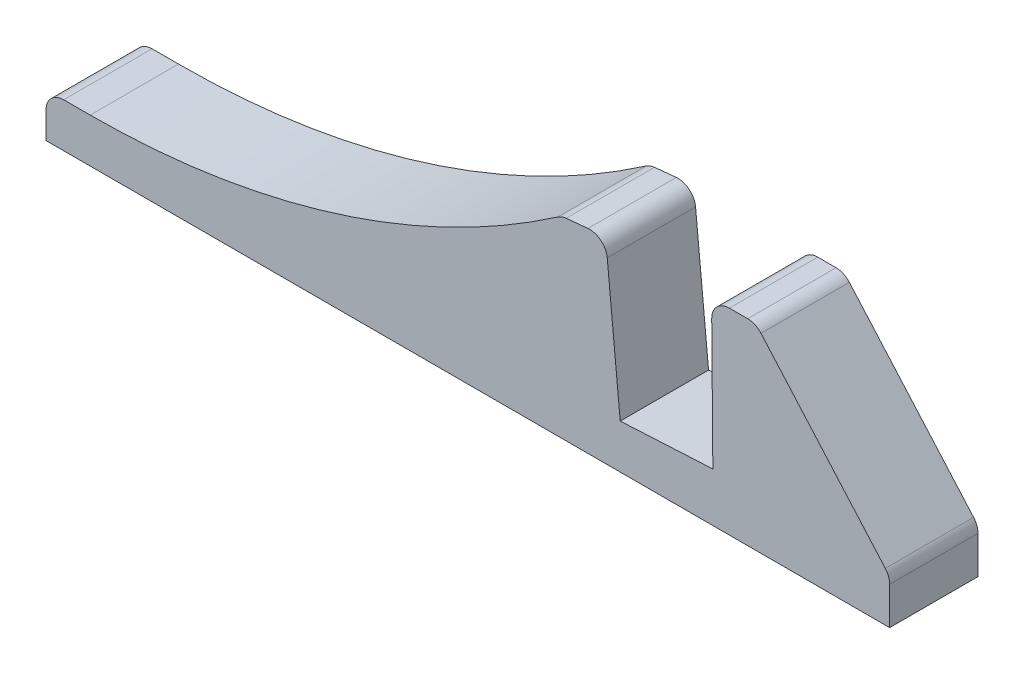
ISO-10303-21;
HEADER;
FILE_DESCRIPTION(('STEP AP214'),'2;1');
FILE_NAME('part.step','',(''),(''),'','','');
FILE_SCHEMA(('AUTOMOTIVE_DESIGN { 1 0 10303 214 1 1 1 1 }'));
ENDSEC;
DATA;
#1=APPLICATION_CONTEXT('core data for automotive mechanical design processes');
#2=APPLICATION_PROTOCOL_DEFINITION('international standard','automotive_design',2000,#1);
#3=PRODUCT_CONTEXT('',#1,'mechanical');
#4=PRODUCT('Part','Part','',(#3));
#5=PRODUCT_RELATED_PRODUCT_CATEGORY('part','',(#4));
#6=PRODUCT_DEFINITION_FORMATION('','',#4);
#7=PRODUCT_DEFINITION_CONTEXT('part definition',#1,'design');
#8=PRODUCT_DEFINITION('design','',#6,#7);
#9=PRODUCT_DEFINITION_SHAPE('','',#8);
#10=(LENGTH_UNIT() NAMED_UNIT(*) SI_UNIT(.MILLI.,.METRE.));
#11=(NAMED_UNIT(*) PLANE_ANGLE_UNIT() SI_UNIT($,.RADIAN.));
#12=(NAMED_UNIT(*) SI_UNIT($,.STERADIAN.) SOLID_ANGLE_UNIT());
#13=UNCERTAINTY_MEASURE_WITH_UNIT(LENGTH_MEASURE(1.E-05),#10,'distance_accuracy_value','');
#14=(GEOMETRIC_REPRESENTATION_CONTEXT(3) GLOBAL_UNCERTAINTY_ASSIGNED_CONTEXT((#13)) GLOBAL_UNIT_ASSIGNED_CONTEXT((#10,
#11,#12)) REPRESENTATION_CONTEXT('',''));
#15=CARTESIAN_POINT('',(0.,0.,0.));
#16=DIRECTION('',(0.,0.,1.));
#17=DIRECTION('',(1.,0.,0.));
#18=AXIS2_PLACEMENT_3D('',#15,#16,#17);
#19=CARTESIAN_POINT('',(0.,0.,10.));
#20=DIRECTION('',(1.,0.,0.));
#21=DIRECTION('',(0.,0.,-1.));
#22=AXIS2_PLACEMENT_3D('',#19,#20,#21);
#23=PLANE('',#22);
#24=DIRECTION('',(0.,-1.,0.));
#25=VECTOR('',#24,1.);
#26=CARTESIAN_POINT('',(0.,0.,10.));
#27=LINE('',#26,#25);
#28=CARTESIAN_POINT('',(0.,3.,10.));
#29=VERTEX_POINT('',#28);
#30=CARTESIAN_POINT('',(0.,0.,10.));
#31=VERTEX_POINT('',#30);
#32=EDGE_CURVE('E151',#29,#31,#27,.T.);
#33=ORIENTED_EDGE('',*,*,#32,.F.);
#34=DIRECTION('',(0.,0.,-1.));
#35=VECTOR('',#34,1.);
#36=CARTESIAN_POINT('',(0.,3.,10.));
#37=LINE('',#36,#35);
#38=CARTESIAN_POINT('',(0.,3.,0.));
#39=VERTEX_POINT('',#38);
#40=EDGE_CURVE('E178',#29,#39,#37,.T.);
#41=ORIENTED_EDGE('',*,*,#40,.T.);
#42=DIRECTION('',(0.,-1.,0.));
#43=VECTOR('',#42,1.);
#44=CARTESIAN_POINT('',(0.,0.,0.));
#45=LINE('',#44,#43);
#46=CARTESIAN_POINT('',(0.,0.,0.));
#47=VERTEX_POINT('',#46);
#48=EDGE_CURVE('E176',#39,#47,#45,.T.);
#49=ORIENTED_EDGE('',*,*,#48,.T.);
#50=DIRECTION('',(0.,0.,-1.));
#51=VECTOR('',#50,1.);
#52=CARTESIAN_POINT('',(0.,0.,10.));
#53=LINE('',#52,#51);
#54=EDGE_CURVE('E169',#31,#47,#53,.T.);
#55=ORIENTED_EDGE('',*,*,#54,.F.);
#56=EDGE_LOOP('',(#33,#41,#49,#55));
#57=FACE_BOUND('',#56,.T.);
#58=ADVANCED_FACE('F33',(#57),#23,.F.);
#59=CARTESIAN_POINT('',(0.,0.,10.));
#60=DIRECTION('',(0.,1.,0.));
#61=DIRECTION('',(0.,0.,1.));
#62=AXIS2_PLACEMENT_3D('',#59,#60,#61);
#63=PLANE('',#62);
#64=DIRECTION('',(1.,0.,0.));
#65=VECTOR('',#64,1.);
#66=CARTESIAN_POINT('',(0.,0.,0.));
#67=LINE('',#66,#65);
#68=CARTESIAN_POINT('',(95.5,0.,0.));
#69=VERTEX_POINT('',#68);
#70=EDGE_CURVE('E312',#47,#69,#67,.T.);
#71=ORIENTED_EDGE('',*,*,#70,.T.);
#72=DIRECTION('',(0.,0.,-1.));
#73=VECTOR('',#72,1.);
#74=CARTESIAN_POINT('',(95.5,0.,10.));
#75=LINE('',#74,#73);
#76=CARTESIAN_POINT('',(95.5,0.,10.));
#77=VERTEX_POINT('',#76);
#78=EDGE_CURVE('E171',#77,#69,#75,.T.);
#79=ORIENTED_EDGE('',*,*,#78,.F.);
#80=DIRECTION('',(1.,0.,0.));
#81=VECTOR('',#80,1.);
#82=CARTESIAN_POINT('',(0.,0.,10.));
#83=LINE('',#82,#81);
#84=EDGE_CURVE('E156',#31,#77,#83,.T.);
#85=ORIENTED_EDGE('',*,*,#84,.F.);
#86=ORIENTED_EDGE('',*,*,#54,.T.);
#87=EDGE_LOOP('',(#71,#79,#85,#86));
#88=FACE_BOUND('',#87,.T.);
#89=ADVANCED_FACE('F168',(#88),#63,.F.);
#90=CARTESIAN_POINT('',(95.5,0.,10.));
#91=DIRECTION('',(-1.,0.,0.));
#92=DIRECTION('',(0.,0.,1.));
#93=AXIS2_PLACEMENT_3D('',#90,#91,#92);
#94=PLANE('',#93);
#95=DIRECTION('',(0.,1.,0.));
#96=VECTOR('',#95,1.);
#97=CARTESIAN_POINT('',(95.5,0.,0.));
#98=LINE('',#97,#96);
#99=CARTESIAN_POINT('',(95.5,4.24609387964052,0.));
#100=VERTEX_POINT('',#99);
#101=EDGE_CURVE('E260',#69,#100,#98,.T.);
#102=ORIENTED_EDGE('',*,*,#101,.T.);
#103=DIRECTION('',(0.,0.,-1.));
#104=VECTOR('',#103,1.);
#105=CARTESIAN_POINT('',(95.5,4.24609387964052,10.));
#106=LINE('',#105,#104);
#107=CARTESIAN_POINT('',(95.5,4.24609387964052,10.));
#108=VERTEX_POINT('',#107);
#109=EDGE_CURVE('E11',#100,#108,#106,.F.);
#110=ORIENTED_EDGE('',*,*,#109,.T.);
#111=DIRECTION('',(0.,1.,0.));
#112=VECTOR('',#111,1.);
#113=CARTESIAN_POINT('',(95.5,0.,10.));
#114=LINE('',#113,#112);
#115=EDGE_CURVE('E173',#77,#108,#114,.T.);
#116=ORIENTED_EDGE('',*,*,#115,.F.);
#117=ORIENTED_EDGE('',*,*,#78,.T.);
#118=EDGE_LOOP('',(#102,#110,#116,#117));
#119=FACE_BOUND('',#118,.T.);
#120=ADVANCED_FACE('F317',(#119),#94,.F.);
#121=CARTESIAN_POINT('',(80.33985450735,22.2514658611032,10.));
#122=DIRECTION('',(-0.751169941960769,-0.660108868516895,0.));
#123=DIRECTION('',(0.660108868516895,-0.751169941960769,0.));
#124=AXIS2_PLACEMENT_3D('',#121,#122,#123);
#125=PLANE('',#124);
#126=DIRECTION('',(-0.660108868516895,0.751169941960769,0.));
#127=VECTOR('',#126,1.);
#128=CARTESIAN_POINT('',(80.33985450735,22.2514658611032,0.));
#129=LINE('',#128,#127);
#130=CARTESIAN_POINT('',(95.0023398839215,5.56631161667431,0.));
#131=VERTEX_POINT('',#130);
#132=CARTESIAN_POINT('',(80.9372297155129,21.571683598137,0.));
#133=VERTEX_POINT('',#132);
#134=EDGE_CURVE('E237',#131,#133,#129,.T.);
#135=ORIENTED_EDGE('',*,*,#134,.T.);
#136=DIRECTION('',(0.,0.,-1.));
#137=VECTOR('',#136,1.);
#138=CARTESIAN_POINT('',(80.9372297155129,21.571683598137,10.));
#139=LINE('',#138,#137);
#140=CARTESIAN_POINT('',(80.9372297155129,21.571683598137,10.));
#141=VERTEX_POINT('',#140);
#142=EDGE_CURVE('E41',#133,#141,#139,.F.);
#143=ORIENTED_EDGE('',*,*,#142,.T.);
#144=DIRECTION('',(-0.660108868516895,0.751169941960769,0.));
#145=VECTOR('',#144,1.);
#146=CARTESIAN_POINT('',(80.33985450735,22.2514658611032,10.));
#147=LINE('',#146,#145);
#148=CARTESIAN_POINT('',(95.0023398839215,5.56631161667431,10.));
#149=VERTEX_POINT('',#148);
#150=EDGE_CURVE('E234',#149,#141,#147,.T.);
#151=ORIENTED_EDGE('',*,*,#150,.F.);
#152=DIRECTION('',(0.,0.,-1.));
#153=VECTOR('',#152,1.);
#154=CARTESIAN_POINT('',(95.0023398839215,5.56631161667431,10.));
#155=LINE('',#154,#153);
#156=EDGE_CURVE('E226',#149,#131,#155,.T.);
#157=ORIENTED_EDGE('',*,*,#156,.T.);
#158=EDGE_LOOP('',(#135,#143,#151,#157));
#159=FACE_BOUND('',#158,.T.);
#160=ADVANCED_FACE('F233',(#159),#125,.F.);
#161=CARTESIAN_POINT('',(75.3398545073501,22.2514658611032,10.));
#162=DIRECTION('',(0.,-1.,0.));
#163=DIRECTION('',(0.,0.,-1.));
#164=AXIS2_PLACEMENT_3D('',#161,#162,#163);
#165=PLANE('',#164);
#166=DIRECTION('',(-1.,0.,0.));
#167=VECTOR('',#166,1.);
#168=CARTESIAN_POINT('',(75.3398545073501,22.2514658611032,0.));
#169=LINE('',#168,#167);
#170=CARTESIAN_POINT('',(79.4348898315913,22.2514658611032,0.));
#171=VERTEX_POINT('',#170);
#172=CARTESIAN_POINT('',(77.3573843997031,22.2514658611032,0.));
#173=VERTEX_POINT('',#172);
#174=EDGE_CURVE('E251',#171,#173,#169,.T.);
#175=ORIENTED_EDGE('',*,*,#174,.T.);
#176=DIRECTION('',(0.,0.,-1.));
#177=VECTOR('',#176,1.);
#178=CARTESIAN_POINT('',(77.3573843997031,22.2514658611032,10.));
#179=LINE('',#178,#177);
#180=CARTESIAN_POINT('',(77.3573843997031,22.2514658611032,10.));
#181=VERTEX_POINT('',#180);
#182=EDGE_CURVE('E224',#173,#181,#179,.F.);
#183=ORIENTED_EDGE('',*,*,#182,.T.);
#184=DIRECTION('',(-1.,0.,0.));
#185=VECTOR('',#184,1.);
#186=CARTESIAN_POINT('',(75.3398545073501,22.2514658611032,10.));
#187=LINE('',#186,#185);
#188=CARTESIAN_POINT('',(79.4348898315913,22.2514658611032,10.));
#189=VERTEX_POINT('',#188);
#190=EDGE_CURVE('E243',#189,#181,#187,.T.);
#191=ORIENTED_EDGE('',*,*,#190,.F.);
#192=DIRECTION('',(0.,0.,-1.));
#193=VECTOR('',#192,1.);
#194=CARTESIAN_POINT('',(79.4348898315913,22.2514658611032,10.));
#195=LINE('',#194,#193);
#196=EDGE_CURVE('E221',#189,#171,#195,.T.);
#197=ORIENTED_EDGE('',*,*,#196,.T.);
#198=EDGE_LOOP('',(#175,#183,#191,#197));
#199=FACE_BOUND('',#198,.T.);
#200=ADVANCED_FACE('F250',(#199),#165,.F.);
#201=CARTESIAN_POINT('',(75.485610114923,5.54952754055095,10.));
#202=DIRECTION('',(0.999961923064171,0.00872653549838039,0.));
#203=DIRECTION('',(-0.00872653549838039,0.999961923064171,0.));
#204=AXIS2_PLACEMENT_3D('',#201,#202,#203);
#205=PLANE('',#204);
#206=DIRECTION('',(0.00872653549838039,-0.999961923064171,0.));
#207=VECTOR('',#206,1.);
#208=CARTESIAN_POINT('',(75.485610114923,5.54952754055095,10.));
#209=LINE('',#208,#207);
#210=CARTESIAN_POINT('',(75.3574605535747,20.2340127901065,10.));
#211=VERTEX_POINT('',#210);
#212=CARTESIAN_POINT('',(75.485610114923,5.54952754055095,10.));
#213=VERTEX_POINT('',#212);
#214=EDGE_CURVE('E348',#211,#213,#209,.T.);
#215=ORIENTED_EDGE('',*,*,#214,.F.);
#216=DIRECTION('',(0.,0.,-1.));
#217=VECTOR('',#216,1.);
#218=CARTESIAN_POINT('',(75.3574605535747,20.2340127901065,10.));
#219=LINE('',#218,#217);
#220=CARTESIAN_POINT('',(75.3574605535747,20.2340127901065,0.));
#221=VERTEX_POINT('',#220);
#222=EDGE_CURVE('E218',#211,#221,#219,.T.);
#223=ORIENTED_EDGE('',*,*,#222,.T.);
#224=DIRECTION('',(0.00872653549838039,-0.999961923064171,0.));
#225=VECTOR('',#224,1.);
#226=CARTESIAN_POINT('',(75.485610114923,5.54952754055095,0.));
#227=LINE('',#226,#225);
#228=CARTESIAN_POINT('',(75.485610114923,5.54952754055095,0.));
#229=VERTEX_POINT('',#228);
#230=EDGE_CURVE('E256',#221,#229,#227,.T.);
#231=ORIENTED_EDGE('',*,*,#230,.T.);
#232=DIRECTION('',(0.,0.,-1.));
#233=VECTOR('',#232,1.);
#234=CARTESIAN_POINT('',(75.485610114923,5.54952754055095,10.));
#235=LINE('',#234,#233);
#236=EDGE_CURVE('E182',#213,#229,#235,.T.);
#237=ORIENTED_EDGE('',*,*,#236,.F.);
#238=EDGE_LOOP('',(#215,#223,#231,#237));
#239=FACE_BOUND('',#238,.T.);
#240=ADVANCED_FACE('F349',(#239),#205,.F.);
#241=CARTESIAN_POINT('',(65.,5.,10.));
#242=DIRECTION('',(0.0523359562429482,-0.998629534754574,0.));
#243=DIRECTION('',(0.998629534754574,0.0523359562429483,0.));
#244=AXIS2_PLACEMENT_3D('',#241,#242,#243);
#245=PLANE('',#244);
#246=DIRECTION('',(-0.998629534754574,-0.0523359562429483,0.));
#247=VECTOR('',#246,1.);
#248=CARTESIAN_POINT('',(65.,5.,0.));
#249=LINE('',#248,#247);
#250=CARTESIAN_POINT('',(65.,5.,0.));
#251=VERTEX_POINT('',#250);
#252=EDGE_CURVE('E258',#229,#251,#249,.T.);
#253=ORIENTED_EDGE('',*,*,#252,.T.);
#254=DIRECTION('',(0.,0.,-1.));
#255=VECTOR('',#254,1.);
#256=CARTESIAN_POINT('',(65.,5.,10.));
#257=LINE('',#256,#255);
#258=CARTESIAN_POINT('',(65.,5.,10.));
#259=VERTEX_POINT('',#258);
#260=EDGE_CURVE('E277',#259,#251,#257,.T.);
#261=ORIENTED_EDGE('',*,*,#260,.F.);
#262=DIRECTION('',(-0.998629534754574,-0.0523359562429483,0.));
#263=VECTOR('',#262,1.);
#264=CARTESIAN_POINT('',(65.,5.,10.));
#265=LINE('',#264,#263);
#266=EDGE_CURVE('E287',#213,#259,#265,.T.);
#267=ORIENTED_EDGE('',*,*,#266,.F.);
#268=ORIENTED_EDGE('',*,*,#236,.T.);
#269=EDGE_LOOP('',(#253,#261,#267,#268));
#270=FACE_BOUND('',#269,.T.);
#271=ADVANCED_FACE('F285',(#270),#245,.F.);
#272=CARTESIAN_POINT('',(63.338872772222,22.2514658611032,10.));
#273=DIRECTION('',(-0.995396198367179,-0.0958457525202264,0.));
#274=DIRECTION('',(0.0958457525202264,-0.995396198367179,0.));
#275=AXIS2_PLACEMENT_3D('',#272,#273,#274);
#276=PLANE('',#275);
#277=DIRECTION('',(-0.0958457525202264,0.995396198367178,0.));
#278=VECTOR('',#277,1.);
#279=CARTESIAN_POINT('',(63.338872772222,22.2514658611032,0.));
#280=LINE('',#279,#278);
#281=CARTESIAN_POINT('',(63.5305642772624,20.2606734643689,0.));
#282=VERTEX_POINT('',#281);
#283=EDGE_CURVE('E265',#251,#282,#280,.T.);
#284=ORIENTED_EDGE('',*,*,#283,.T.);
#285=DIRECTION('',(0.,0.,-1.));
#286=VECTOR('',#285,1.);
#287=CARTESIAN_POINT('',(63.5305642772624,20.2606734643689,10.));
#288=LINE('',#287,#286);
#289=CARTESIAN_POINT('',(63.5305642772624,20.2606734643689,10.));
#290=VERTEX_POINT('',#289);
#291=EDGE_CURVE('E216',#282,#290,#288,.F.);
#292=ORIENTED_EDGE('',*,*,#291,.T.);
#293=DIRECTION('',(-0.0958457525202264,0.995396198367178,0.));
#294=VECTOR('',#293,1.);
#295=CARTESIAN_POINT('',(63.338872772222,22.2514658611032,10.));
#296=LINE('',#295,#294);
#297=EDGE_CURVE('E302',#259,#290,#296,.T.);
#298=ORIENTED_EDGE('',*,*,#297,.F.);
#299=ORIENTED_EDGE('',*,*,#260,.T.);
#300=EDGE_LOOP('',(#284,#292,#298,#299));
#301=FACE_BOUND('',#300,.T.);
#302=ADVANCED_FACE('F294',(#301),#276,.F.);
#303=CARTESIAN_POINT('',(63.338872772222,22.2514658611032,10.));
#304=DIRECTION('',(0.0958457525202266,-0.995396198367179,0.));
#305=DIRECTION('',(0.995396198367179,0.0958457525202266,0.));
#306=AXIS2_PLACEMENT_3D('',#303,#304,#305);
#307=PLANE('',#306);
#308=DIRECTION('',(-0.995396198367179,-0.0958457525202266,0.));
#309=VECTOR('',#308,1.);
#310=CARTESIAN_POINT('',(63.338872772222,22.2514658611032,0.));
#311=LINE('',#310,#309);
#312=CARTESIAN_POINT('',(61.3480803754876,22.0597743560628,0.));
#313=VERTEX_POINT('',#312);
#314=CARTESIAN_POINT('',(58.8811529793022,21.8222362651116,0.));
#315=VERTEX_POINT('',#314);
#316=EDGE_CURVE('E268',#313,#315,#311,.T.);
#317=ORIENTED_EDGE('',*,*,#316,.T.);
#318=DIRECTION('',(0.,0.,-1.));
#319=VECTOR('',#318,1.);
#320=CARTESIAN_POINT('',(58.8811529793022,21.8222362651116,10.));
#321=LINE('',#320,#319);
#322=CARTESIAN_POINT('',(58.8811529793022,21.8222362651116,10.));
#323=VERTEX_POINT('',#322);
#324=EDGE_CURVE('E56',#315,#323,#321,.F.);
#325=ORIENTED_EDGE('',*,*,#324,.T.);
#326=DIRECTION('',(-0.995396198367179,-0.0958457525202266,0.));
#327=VECTOR('',#326,1.);
#328=CARTESIAN_POINT('',(63.338872772222,22.2514658611032,10.));
#329=LINE('',#328,#327);
#330=CARTESIAN_POINT('',(61.3480803754876,22.0597743560628,10.));
#331=VERTEX_POINT('',#330);
#332=EDGE_CURVE('E301',#331,#323,#329,.T.);
#333=ORIENTED_EDGE('',*,*,#332,.F.);
#334=DIRECTION('',(0.,0.,-1.));
#335=VECTOR('',#334,1.);
#336=CARTESIAN_POINT('',(61.3480803754876,22.0597743560628,10.));
#337=LINE('',#336,#335);
#338=EDGE_CURVE('E212',#331,#313,#337,.T.);
#339=ORIENTED_EDGE('',*,*,#338,.T.);
#340=EDGE_LOOP('',(#317,#325,#333,#339));
#341=FACE_BOUND('',#340,.T.);
#342=ADVANCED_FACE('F303',(#341),#307,.F.);
#343=CARTESIAN_POINT('',(5.,98.2731696223588,10.));
#344=DIRECTION('',(0.,0.,-1.));
#345=DIRECTION('',(-1.,0.,0.));
#346=AXIS2_PLACEMENT_3D('',#343,#344,#345);
#347=CYLINDRICAL_SURFACE('',#346,93.2731696223588);
#348=CARTESIAN_POINT('',(5.,98.2731696223588,10.));
#349=DIRECTION('',(0.,0.,-1.));
#350=DIRECTION('',(1.,0.,0.));
#351=AXIS2_PLACEMENT_3D('',#348,#349,#350);
#352=CIRCLE('',#351,93.2731696223588);
#353=CARTESIAN_POINT('',(57.9377327902807,21.4781136719517,10.));
#354=VERTEX_POINT('',#353);
#355=CARTESIAN_POINT('',(4.99999999999998,5.00000000000002,10.));
#356=VERTEX_POINT('',#355);
#357=EDGE_CURVE('E304',#354,#356,#352,.T.);
#358=ORIENTED_EDGE('',*,*,#357,.F.);
#359=DIRECTION('',(0.,0.,-1.));
#360=VECTOR('',#359,1.);
#361=CARTESIAN_POINT('',(57.9377327902807,21.4781136719517,10.));
#362=LINE('',#361,#360);
#363=CARTESIAN_POINT('',(57.9377327902807,21.4781136719517,0.));
#364=VERTEX_POINT('',#363);
#365=EDGE_CURVE('E209',#354,#364,#362,.T.);
#366=ORIENTED_EDGE('',*,*,#365,.T.);
#367=CARTESIAN_POINT('',(5.,98.2731696223588,0.));
#368=DIRECTION('',(0.,0.,-1.));
#369=DIRECTION('',(1.,0.,0.));
#370=AXIS2_PLACEMENT_3D('',#367,#368,#369);
#371=CIRCLE('',#370,93.2731696223588);
#372=CARTESIAN_POINT('',(4.99999999999998,5.00000000000002,0.));
#373=VERTEX_POINT('',#372);
#374=EDGE_CURVE('E270',#364,#373,#371,.T.);
#375=ORIENTED_EDGE('',*,*,#374,.T.);
#376=DIRECTION('',(0.,0.,-1.));
#377=VECTOR('',#376,1.);
#378=CARTESIAN_POINT('',(4.99999999999998,5.00000000000002,10.));
#379=LINE('',#378,#377);
#380=EDGE_CURVE('E274',#356,#373,#379,.T.);
#381=ORIENTED_EDGE('',*,*,#380,.F.);
#382=EDGE_LOOP('',(#358,#366,#375,#381));
#383=FACE_BOUND('',#382,.T.);
#384=ADVANCED_FACE('F398',(#383),#347,.F.);
#385=CARTESIAN_POINT('',(0.,5.,10.));
#386=DIRECTION('',(0.,-1.,0.));
#387=DIRECTION('',(0.,0.,-1.));
#388=AXIS2_PLACEMENT_3D('',#385,#386,#387);
#389=PLANE('',#388);
#390=DIRECTION('',(-1.,0.,0.));
#391=VECTOR('',#390,1.);
#392=CARTESIAN_POINT('',(0.,5.,0.));
#393=LINE('',#392,#391);
#394=CARTESIAN_POINT('',(2.,5.,0.));
#395=VERTEX_POINT('',#394);
#396=EDGE_CURVE('E164',#373,#395,#393,.T.);
#397=ORIENTED_EDGE('',*,*,#396,.T.);
#398=DIRECTION('',(0.,0.,-1.));
#399=VECTOR('',#398,1.);
#400=CARTESIAN_POINT('',(2.,5.,10.));
#401=LINE('',#400,#399);
#402=CARTESIAN_POINT('',(2.,5.,10.));
#403=VERTEX_POINT('',#402);
#404=EDGE_CURVE('E197',#395,#403,#401,.F.);
#405=ORIENTED_EDGE('',*,*,#404,.T.);
#406=DIRECTION('',(-1.,0.,0.));
#407=VECTOR('',#406,1.);
#408=CARTESIAN_POINT('',(0.,5.,10.));
#409=LINE('',#408,#407);
#410=EDGE_CURVE('E278',#356,#403,#409,.T.);
#411=ORIENTED_EDGE('',*,*,#410,.F.);
#412=ORIENTED_EDGE('',*,*,#380,.T.);
#413=EDGE_LOOP('',(#397,#405,#411,#412));
#414=FACE_BOUND('',#413,.T.);
#415=ADVANCED_FACE('F407',(#414),#389,.F.);
#416=CARTESIAN_POINT('',(5.,98.2731696223588,10.));
#417=DIRECTION('',(0.,0.,1.));
#418=DIRECTION('',(1.,0.,0.));
#419=AXIS2_PLACEMENT_3D('',#416,#417,#418);
#420=PLANE('',#419);
#421=ORIENTED_EDGE('',*,*,#410,.T.);
#422=CARTESIAN_POINT('',(2.,3.,10.));
#423=DIRECTION('',(0.,0.,1.));
#424=DIRECTION('',(1.,0.,0.));
#425=AXIS2_PLACEMENT_3D('',#422,#423,#424);
#426=CIRCLE('',#425,2.);
#427=EDGE_CURVE('E159',#403,#29,#426,.T.);
#428=ORIENTED_EDGE('',*,*,#427,.T.);
#429=ORIENTED_EDGE('',*,*,#32,.T.);
#430=ORIENTED_EDGE('',*,*,#84,.T.);
#431=ORIENTED_EDGE('',*,*,#115,.T.);
#432=CARTESIAN_POINT('',(93.5,4.24609387964052,10.));
#433=DIRECTION('',(0.,0.,1.));
#434=DIRECTION('',(1.,0.,0.));
#435=AXIS2_PLACEMENT_3D('',#432,#433,#434);
#436=CIRCLE('',#435,2.);
#437=EDGE_CURVE('E199',#108,#149,#436,.T.);
#438=ORIENTED_EDGE('',*,*,#437,.T.);
#439=ORIENTED_EDGE('',*,*,#150,.T.);
#440=CARTESIAN_POINT('',(79.4348898315913,20.2514658611032,10.));
#441=DIRECTION('',(0.,0.,1.));
#442=DIRECTION('',(1.,0.,0.));
#443=AXIS2_PLACEMENT_3D('',#440,#441,#442);
#444=CIRCLE('',#443,2.);
#445=EDGE_CURVE('E201',#141,#189,#444,.T.);
#446=ORIENTED_EDGE('',*,*,#445,.T.);
#447=ORIENTED_EDGE('',*,*,#190,.T.);
#448=CARTESIAN_POINT('',(77.3573843997031,20.2514658611032,10.));
#449=DIRECTION('',(0.,0.,1.));
#450=DIRECTION('',(1.,0.,0.));
#451=AXIS2_PLACEMENT_3D('',#448,#449,#450);
#452=CIRCLE('',#451,2.);
#453=EDGE_CURVE('E203',#181,#211,#452,.T.);
#454=ORIENTED_EDGE('',*,*,#453,.T.);
#455=ORIENTED_EDGE('',*,*,#214,.T.);
#456=ORIENTED_EDGE('',*,*,#266,.T.);
#457=ORIENTED_EDGE('',*,*,#297,.T.);
#458=CARTESIAN_POINT('',(61.5397718805281,20.0689819593284,10.));
#459=DIRECTION('',(0.,0.,1.));
#460=DIRECTION('',(1.,0.,0.));
#461=AXIS2_PLACEMENT_3D('',#458,#459,#460);
#462=CIRCLE('',#461,2.);
#463=EDGE_CURVE('E205',#290,#331,#462,.T.);
#464=ORIENTED_EDGE('',*,*,#463,.T.);
#465=ORIENTED_EDGE('',*,*,#332,.T.);
#466=CARTESIAN_POINT('',(59.0728444843426,19.8314438683773,10.));
#467=DIRECTION('',(0.,0.,1.));
#468=DIRECTION('',(1.,0.,0.));
#469=AXIS2_PLACEMENT_3D('',#466,#467,#468);
#470=CIRCLE('',#469,2.);
#471=EDGE_CURVE('E48',#323,#354,#470,.T.);
#472=ORIENTED_EDGE('',*,*,#471,.T.);
#473=ORIENTED_EDGE('',*,*,#357,.T.);
#474=EDGE_LOOP('',(#421,#428,#429,#430,#431,#438,#439,#446,#447,#454,#455,#456,#457,#464,#465,
#472,#473));
#475=FACE_BOUND('',#474,.T.);
#476=ADVANCED_FACE('F154',(#475),#420,.T.);
#477=CARTESIAN_POINT('',(5.,98.2731696223588,0.));
#478=DIRECTION('',(0.,0.,1.));
#479=DIRECTION('',(1.,0.,0.));
#480=AXIS2_PLACEMENT_3D('',#477,#478,#479);
#481=PLANE('',#480);
#482=ORIENTED_EDGE('',*,*,#48,.F.);
#483=CARTESIAN_POINT('',(2.,3.,0.));
#484=DIRECTION('',(0.,0.,1.));
#485=DIRECTION('',(1.,0.,0.));
#486=AXIS2_PLACEMENT_3D('',#483,#484,#485);
#487=CIRCLE('',#486,2.);
#488=EDGE_CURVE('E195',#39,#395,#487,.F.);
#489=ORIENTED_EDGE('',*,*,#488,.T.);
#490=ORIENTED_EDGE('',*,*,#396,.F.);
#491=ORIENTED_EDGE('',*,*,#374,.F.);
#492=CARTESIAN_POINT('',(59.0728444843426,19.8314438683773,0.));
#493=DIRECTION('',(0.,0.,1.));
#494=DIRECTION('',(1.,0.,0.));
#495=AXIS2_PLACEMENT_3D('',#492,#493,#494);
#496=CIRCLE('',#495,2.);
#497=EDGE_CURVE('E193',#364,#315,#496,.F.);
#498=ORIENTED_EDGE('',*,*,#497,.T.);
#499=ORIENTED_EDGE('',*,*,#316,.F.);
#500=CARTESIAN_POINT('',(61.5397718805281,20.0689819593284,0.));
#501=DIRECTION('',(0.,0.,1.));
#502=DIRECTION('',(1.,0.,0.));
#503=AXIS2_PLACEMENT_3D('',#500,#501,#502);
#504=CIRCLE('',#503,2.);
#505=EDGE_CURVE('E191',#313,#282,#504,.F.);
#506=ORIENTED_EDGE('',*,*,#505,.T.);
#507=ORIENTED_EDGE('',*,*,#283,.F.);
#508=ORIENTED_EDGE('',*,*,#252,.F.);
#509=ORIENTED_EDGE('',*,*,#230,.F.);
#510=CARTESIAN_POINT('',(77.3573843997031,20.2514658611032,0.));
#511=DIRECTION('',(0.,0.,1.));
#512=DIRECTION('',(1.,0.,0.));
#513=AXIS2_PLACEMENT_3D('',#510,#511,#512);
#514=CIRCLE('',#513,2.);
#515=EDGE_CURVE('E189',#221,#173,#514,.F.);
#516=ORIENTED_EDGE('',*,*,#515,.T.);
#517=ORIENTED_EDGE('',*,*,#174,.F.);
#518=CARTESIAN_POINT('',(79.4348898315913,20.2514658611032,0.));
#519=DIRECTION('',(0.,0.,1.));
#520=DIRECTION('',(1.,0.,0.));
#521=AXIS2_PLACEMENT_3D('',#518,#519,#520);
#522=CIRCLE('',#521,2.);
#523=EDGE_CURVE('E187',#171,#133,#522,.F.);
#524=ORIENTED_EDGE('',*,*,#523,.T.);
#525=ORIENTED_EDGE('',*,*,#134,.F.);
#526=CARTESIAN_POINT('',(93.5,4.24609387964052,0.));
#527=DIRECTION('',(0.,0.,1.));
#528=DIRECTION('',(1.,0.,0.));
#529=AXIS2_PLACEMENT_3D('',#526,#527,#528);
#530=CIRCLE('',#529,2.);
#531=EDGE_CURVE('E180',#131,#100,#530,.F.);
#532=ORIENTED_EDGE('',*,*,#531,.T.);
#533=ORIENTED_EDGE('',*,*,#101,.F.);
#534=ORIENTED_EDGE('',*,*,#70,.F.);
#535=EDGE_LOOP('',(#482,#489,#490,#491,#498,#499,#506,#507,#508,#509,#516,#517,#524,#525,#532,
#533,#534));
#536=FACE_BOUND('',#535,.T.);
#537=ADVANCED_FACE('F254',(#536),#481,.F.);
#538=CARTESIAN_POINT('',(2.,3.,10.));
#539=DIRECTION('',(0.,0.,-1.));
#540=DIRECTION('',(-1.,0.,0.));
#541=AXIS2_PLACEMENT_3D('',#538,#539,#540);
#542=CYLINDRICAL_SURFACE('',#541,2.);
#543=ORIENTED_EDGE('',*,*,#427,.F.);
#544=ORIENTED_EDGE('',*,*,#404,.F.);
#545=ORIENTED_EDGE('',*,*,#488,.F.);
#546=ORIENTED_EDGE('',*,*,#40,.F.);
#547=EDGE_LOOP('',(#543,#544,#545,#546));
#548=FACE_BOUND('',#547,.T.);
#549=ADVANCED_FACE('F332',(#548),#542,.T.);
#550=CARTESIAN_POINT('',(59.0728444843426,19.8314438683773,10.));
#551=DIRECTION('',(0.,0.,-1.));
#552=DIRECTION('',(-1.,0.,0.));
#553=AXIS2_PLACEMENT_3D('',#550,#551,#552);
#554=CYLINDRICAL_SURFACE('',#553,2.);
#555=ORIENTED_EDGE('',*,*,#471,.F.);
#556=ORIENTED_EDGE('',*,*,#324,.F.);
#557=ORIENTED_EDGE('',*,*,#497,.F.);
#558=ORIENTED_EDGE('',*,*,#365,.F.);
#559=EDGE_LOOP('',(#555,#556,#557,#558));
#560=FACE_BOUND('',#559,.T.);
#561=ADVANCED_FACE('F335',(#560),#554,.T.);
#562=CARTESIAN_POINT('',(61.5397718805281,20.0689819593284,10.));
#563=DIRECTION('',(0.,0.,-1.));
#564=DIRECTION('',(-1.,0.,0.));
#565=AXIS2_PLACEMENT_3D('',#562,#563,#564);
#566=CYLINDRICAL_SURFACE('',#565,2.);
#567=ORIENTED_EDGE('',*,*,#463,.F.);
#568=ORIENTED_EDGE('',*,*,#291,.F.);
#569=ORIENTED_EDGE('',*,*,#505,.F.);
#570=ORIENTED_EDGE('',*,*,#338,.F.);
#571=EDGE_LOOP('',(#567,#568,#569,#570));
#572=FACE_BOUND('',#571,.T.);
#573=ADVANCED_FACE('F299',(#572),#566,.T.);
#574=CARTESIAN_POINT('',(77.3573843997031,20.2514658611032,10.));
#575=DIRECTION('',(0.,0.,-1.));
#576=DIRECTION('',(-1.,0.,0.));
#577=AXIS2_PLACEMENT_3D('',#574,#575,#576);
#578=CYLINDRICAL_SURFACE('',#577,2.);
#579=ORIENTED_EDGE('',*,*,#453,.F.);
#580=ORIENTED_EDGE('',*,*,#182,.F.);
#581=ORIENTED_EDGE('',*,*,#515,.F.);
#582=ORIENTED_EDGE('',*,*,#222,.F.);
#583=EDGE_LOOP('',(#579,#580,#581,#582));
#584=FACE_BOUND('',#583,.T.);
#585=ADVANCED_FACE('F323',(#584),#578,.T.);
#586=CARTESIAN_POINT('',(79.4348898315913,20.2514658611032,10.));
#587=DIRECTION('',(0.,0.,-1.));
#588=DIRECTION('',(-1.,0.,0.));
#589=AXIS2_PLACEMENT_3D('',#586,#587,#588);
#590=CYLINDRICAL_SURFACE('',#589,2.);
#591=ORIENTED_EDGE('',*,*,#445,.F.);
#592=ORIENTED_EDGE('',*,*,#142,.F.);
#593=ORIENTED_EDGE('',*,*,#523,.F.);
#594=ORIENTED_EDGE('',*,*,#196,.F.);
#595=EDGE_LOOP('',(#591,#592,#593,#594));
#596=FACE_BOUND('',#595,.T.);
#597=ADVANCED_FACE('F246',(#596),#590,.T.);
#598=CARTESIAN_POINT('',(93.5,4.24609387964052,10.));
#599=DIRECTION('',(0.,0.,-1.));
#600=DIRECTION('',(-1.,0.,0.));
#601=AXIS2_PLACEMENT_3D('',#598,#599,#600);
#602=CYLINDRICAL_SURFACE('',#601,2.);
#603=ORIENTED_EDGE('',*,*,#437,.F.);
#604=ORIENTED_EDGE('',*,*,#109,.F.);
#605=ORIENTED_EDGE('',*,*,#531,.F.);
#606=ORIENTED_EDGE('',*,*,#156,.F.);
#607=EDGE_LOOP('',(#603,#604,#605,#606));
#608=FACE_BOUND('',#607,.T.);
#609=ADVANCED_FACE('F35',(#608),#602,.T.);
#610=CLOSED_SHELL('',(#58,#89,#120,#160,#200,#240,#271,#302,#342,#384,#415,#476,#537,#549,#561,
#573,#585,#597,#609));
#611=MANIFOLD_SOLID_BREP('B2',#610);
#612=ADVANCED_BREP_SHAPE_REPRESENTATION('',(#18,#611),#14);
#613=SHAPE_DEFINITION_REPRESENTATION(#9,#612);
ENDSEC;
END-ISO-10303-21;
